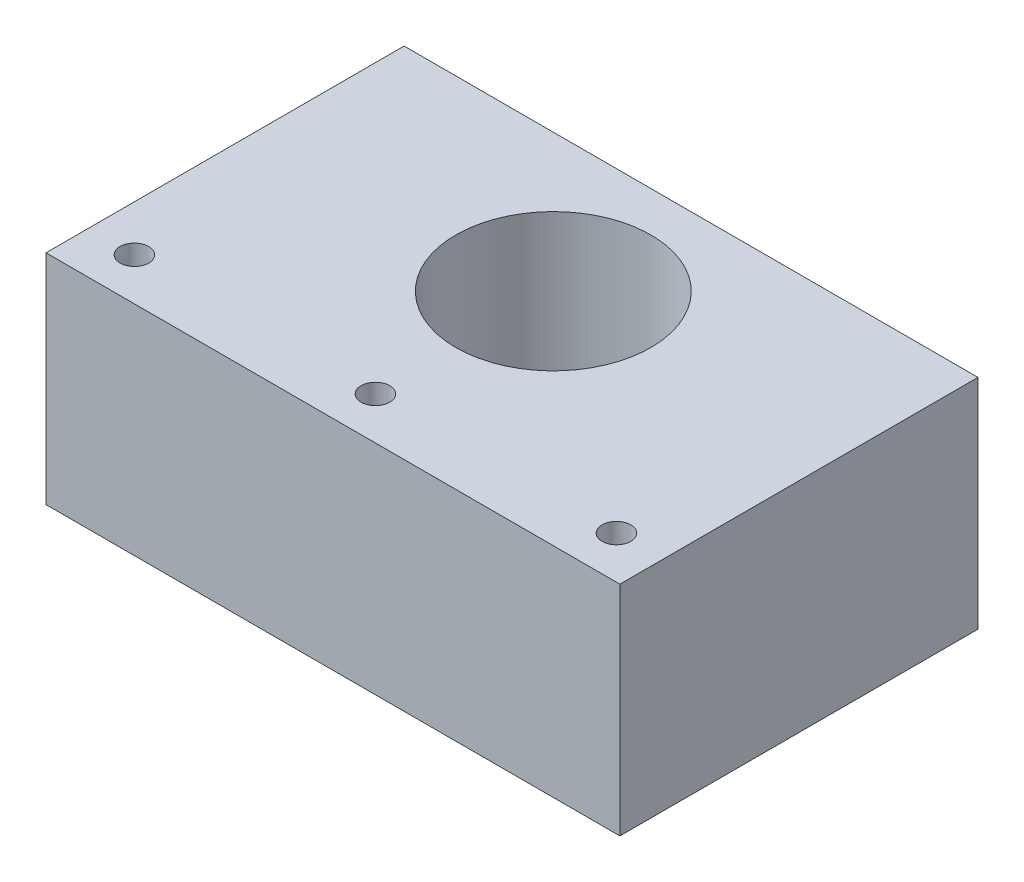
ISO-10303-21;
HEADER;
FILE_DESCRIPTION(('STEP AP214'),'2;1');
FILE_NAME('part.step','',(''),(''),'','','');
FILE_SCHEMA(('AUTOMOTIVE_DESIGN { 1 0 10303 214 1 1 1 1 }'));
ENDSEC;
DATA;
#1=APPLICATION_CONTEXT('core data for automotive mechanical design processes');
#2=APPLICATION_PROTOCOL_DEFINITION('international standard','automotive_design',2000,#1);
#3=PRODUCT_CONTEXT('',#1,'mechanical');
#4=PRODUCT('Part','Part','',(#3));
#5=PRODUCT_RELATED_PRODUCT_CATEGORY('part','',(#4));
#6=PRODUCT_DEFINITION_FORMATION('','',#4);
#7=PRODUCT_DEFINITION_CONTEXT('part definition',#1,'design');
#8=PRODUCT_DEFINITION('design','',#6,#7);
#9=PRODUCT_DEFINITION_SHAPE('','',#8);
#10=(LENGTH_UNIT() NAMED_UNIT(*) SI_UNIT(.MILLI.,.METRE.));
#11=(NAMED_UNIT(*) PLANE_ANGLE_UNIT() SI_UNIT($,.RADIAN.));
#12=(NAMED_UNIT(*) SI_UNIT($,.STERADIAN.) SOLID_ANGLE_UNIT());
#13=UNCERTAINTY_MEASURE_WITH_UNIT(LENGTH_MEASURE(1.E-05),#10,'distance_accuracy_value','');
#14=(GEOMETRIC_REPRESENTATION_CONTEXT(3) GLOBAL_UNCERTAINTY_ASSIGNED_CONTEXT((#13)) GLOBAL_UNIT_ASSIGNED_CONTEXT((#10,
#11,#12)) REPRESENTATION_CONTEXT('',''));
#15=CARTESIAN_POINT('',(0.,0.,0.));
#16=DIRECTION('',(0.,0.,1.));
#17=DIRECTION('',(1.,0.,0.));
#18=AXIS2_PLACEMENT_3D('',#15,#16,#17);
#19=CARTESIAN_POINT('',(0.,12.7,15.24));
#20=DIRECTION('',(0.,-1.,0.));
#21=DIRECTION('',(0.,0.,-1.));
#22=AXIS2_PLACEMENT_3D('',#19,#20,#21);
#23=CYLINDRICAL_SURFACE('',#22,6.35);
#24=CARTESIAN_POINT('',(0.,-7.874,15.24));
#25=DIRECTION('',(0.,-1.,0.));
#26=DIRECTION('',(0.,0.,-1.));
#27=AXIS2_PLACEMENT_3D('',#24,#25,#26);
#28=CIRCLE('',#27,6.35);
#29=CARTESIAN_POINT('',(0.,-7.874,8.89));
#30=VERTEX_POINT('',#29);
#31=EDGE_CURVE('E158',#30,#30,#28,.T.);
#32=ORIENTED_EDGE('',*,*,#31,.T.);
#33=EDGE_LOOP('',(#32));
#34=FACE_BOUND('',#33,.T.);
#35=CARTESIAN_POINT('',(0.,-6.35,15.24));
#36=DIRECTION('',(0.,1.,0.));
#37=DIRECTION('',(0.,0.,1.));
#38=AXIS2_PLACEMENT_3D('',#35,#36,#37);
#39=CIRCLE('',#38,6.35);
#40=CARTESIAN_POINT('',(0.,-6.35,21.59));
#41=VERTEX_POINT('',#40);
#42=EDGE_CURVE('E154',#41,#41,#39,.F.);
#43=ORIENTED_EDGE('',*,*,#42,.F.);
#44=EDGE_LOOP('',(#43));
#45=FACE_BOUND('',#44,.T.);
#46=ADVANCED_FACE('F39',(#34,#45),#23,.F.);
#47=CARTESIAN_POINT('',(-31.75,12.7,38.1));
#48=DIRECTION('',(1.,0.,0.));
#49=DIRECTION('',(0.,0.,-1.));
#50=AXIS2_PLACEMENT_3D('',#47,#48,#49);
#51=PLANE('',#50);
#52=DIRECTION('',(0.,-1.,0.));
#53=VECTOR('',#52,1.);
#54=CARTESIAN_POINT('',(-31.75,12.7,0.));
#55=LINE('',#54,#53);
#56=CARTESIAN_POINT('',(-31.75,12.7,0.));
#57=VERTEX_POINT('',#56);
#58=CARTESIAN_POINT('',(-31.75,-11.43,0.));
#59=VERTEX_POINT('',#58);
#60=EDGE_CURVE('E86',#57,#59,#55,.T.);
#61=ORIENTED_EDGE('',*,*,#60,.T.);
#62=DIRECTION('',(0.,0.,1.));
#63=VECTOR('',#62,1.);
#64=CARTESIAN_POINT('',(-31.75,-11.43,0.));
#65=LINE('',#64,#63);
#66=CARTESIAN_POINT('',(-31.75,-11.43,39.624));
#67=VERTEX_POINT('',#66);
#68=EDGE_CURVE('E57',#59,#67,#65,.T.);
#69=ORIENTED_EDGE('',*,*,#68,.T.);
#70=DIRECTION('',(0.,-1.,0.));
#71=VECTOR('',#70,1.);
#72=CARTESIAN_POINT('',(-31.75,12.7,39.624));
#73=LINE('',#72,#71);
#74=CARTESIAN_POINT('',(-31.75,12.7,39.624));
#75=VERTEX_POINT('',#74);
#76=EDGE_CURVE('E84',#75,#67,#73,.T.);
#77=ORIENTED_EDGE('',*,*,#76,.F.);
#78=DIRECTION('',(0.,0.,-1.));
#79=VECTOR('',#78,1.);
#80=CARTESIAN_POINT('',(-31.75,12.7,38.1));
#81=LINE('',#80,#79);
#82=EDGE_CURVE('E49',#75,#57,#81,.T.);
#83=ORIENTED_EDGE('',*,*,#82,.T.);
#84=EDGE_LOOP('',(#61,#69,#77,#83));
#85=FACE_BOUND('',#84,.T.);
#86=ADVANCED_FACE('F41',(#85),#51,.F.);
#87=CARTESIAN_POINT('',(31.75,12.7,38.1));
#88=DIRECTION('',(-1.,0.,0.));
#89=DIRECTION('',(0.,0.,1.));
#90=AXIS2_PLACEMENT_3D('',#87,#88,#89);
#91=PLANE('',#90);
#92=DIRECTION('',(0.,0.,-1.));
#93=VECTOR('',#92,1.);
#94=CARTESIAN_POINT('',(31.75,12.7,38.1));
#95=LINE('',#94,#93);
#96=CARTESIAN_POINT('',(31.75,12.7,39.624));
#97=VERTEX_POINT('',#96);
#98=CARTESIAN_POINT('',(31.75,12.7,0.));
#99=VERTEX_POINT('',#98);
#100=EDGE_CURVE('E11',#97,#99,#95,.T.);
#101=ORIENTED_EDGE('',*,*,#100,.F.);
#102=DIRECTION('',(0.,1.,0.));
#103=VECTOR('',#102,1.);
#104=CARTESIAN_POINT('',(31.75,-11.43,39.624));
#105=LINE('',#104,#103);
#106=CARTESIAN_POINT('',(31.75,-11.43,39.624));
#107=VERTEX_POINT('',#106);
#108=EDGE_CURVE('E99',#107,#97,#105,.T.);
#109=ORIENTED_EDGE('',*,*,#108,.F.);
#110=DIRECTION('',(0.,0.,1.));
#111=VECTOR('',#110,1.);
#112=CARTESIAN_POINT('',(31.75,-11.43,0.));
#113=LINE('',#112,#111);
#114=CARTESIAN_POINT('',(31.75,-11.43,0.));
#115=VERTEX_POINT('',#114);
#116=EDGE_CURVE('E88',#115,#107,#113,.T.);
#117=ORIENTED_EDGE('',*,*,#116,.F.);
#118=DIRECTION('',(0.,1.,0.));
#119=VECTOR('',#118,1.);
#120=CARTESIAN_POINT('',(31.75,12.7,0.));
#121=LINE('',#120,#119);
#122=EDGE_CURVE('E176',#115,#99,#121,.T.);
#123=ORIENTED_EDGE('',*,*,#122,.T.);
#124=EDGE_LOOP('',(#101,#109,#117,#123));
#125=FACE_BOUND('',#124,.T.);
#126=ADVANCED_FACE('F194',(#125),#91,.F.);
#127=CARTESIAN_POINT('',(-31.75,12.7,38.1));
#128=DIRECTION('',(0.,-1.,0.));
#129=DIRECTION('',(0.,0.,-1.));
#130=AXIS2_PLACEMENT_3D('',#127,#128,#129);
#131=PLANE('',#130);
#132=CARTESIAN_POINT('',(-26.67,12.7,34.925));
#133=DIRECTION('',(0.,1.,0.));
#134=DIRECTION('',(0.,0.,1.));
#135=AXIS2_PLACEMENT_3D('',#132,#133,#134);
#136=CIRCLE('',#135,1.5875);
#137=CARTESIAN_POINT('',(-26.67,12.7,36.5125));
#138=VERTEX_POINT('',#137);
#139=EDGE_CURVE('E138',#138,#138,#136,.T.);
#140=ORIENTED_EDGE('',*,*,#139,.F.);
#141=EDGE_LOOP('',(#140));
#142=FACE_BOUND('',#141,.T.);
#143=CARTESIAN_POINT('',(0.,12.7,34.925));
#144=DIRECTION('',(0.,1.,0.));
#145=DIRECTION('',(0.,0.,1.));
#146=AXIS2_PLACEMENT_3D('',#143,#144,#145);
#147=CIRCLE('',#146,1.5875);
#148=CARTESIAN_POINT('',(0.,12.7,36.5125));
#149=VERTEX_POINT('',#148);
#150=EDGE_CURVE('E143',#149,#149,#147,.T.);
#151=ORIENTED_EDGE('',*,*,#150,.F.);
#152=EDGE_LOOP('',(#151));
#153=FACE_BOUND('',#152,.T.);
#154=CARTESIAN_POINT('',(26.67,12.7,34.925));
#155=DIRECTION('',(0.,1.,0.));
#156=DIRECTION('',(0.,0.,1.));
#157=AXIS2_PLACEMENT_3D('',#154,#155,#156);
#158=CIRCLE('',#157,1.5875);
#159=CARTESIAN_POINT('',(26.67,12.7,36.5125));
#160=VERTEX_POINT('',#159);
#161=EDGE_CURVE('E137',#160,#160,#158,.T.);
#162=ORIENTED_EDGE('',*,*,#161,.F.);
#163=EDGE_LOOP('',(#162));
#164=FACE_BOUND('',#163,.T.);
#165=CARTESIAN_POINT('',(0.,12.7,15.24));
#166=DIRECTION('',(0.,1.,0.));
#167=DIRECTION('',(0.,0.,1.));
#168=AXIS2_PLACEMENT_3D('',#165,#166,#167);
#169=CIRCLE('',#168,10.795);
#170=CARTESIAN_POINT('',(0.,12.7,26.035));
#171=VERTEX_POINT('',#170);
#172=EDGE_CURVE('E142',#171,#171,#169,.T.);
#173=ORIENTED_EDGE('',*,*,#172,.F.);
#174=EDGE_LOOP('',(#173));
#175=FACE_BOUND('',#174,.T.);
#176=DIRECTION('',(-1.,0.,0.));
#177=VECTOR('',#176,1.);
#178=CARTESIAN_POINT('',(-31.75,12.7,0.));
#179=LINE('',#178,#177);
#180=EDGE_CURVE('E64',#99,#57,#179,.T.);
#181=ORIENTED_EDGE('',*,*,#180,.T.);
#182=ORIENTED_EDGE('',*,*,#82,.F.);
#183=DIRECTION('',(-1.,0.,0.));
#184=VECTOR('',#183,1.);
#185=CARTESIAN_POINT('',(31.75,12.7,39.624));
#186=LINE('',#185,#184);
#187=EDGE_CURVE('E104',#97,#75,#186,.T.);
#188=ORIENTED_EDGE('',*,*,#187,.F.);
#189=ORIENTED_EDGE('',*,*,#100,.T.);
#190=EDGE_LOOP('',(#181,#182,#188,#189));
#191=FACE_BOUND('',#190,.T.);
#192=ADVANCED_FACE('F226',(#142,#153,#164,#175,#191),#131,.F.);
#193=CARTESIAN_POINT('',(0.,0.,0.));
#194=DIRECTION('',(0.,0.,1.));
#195=DIRECTION('',(1.,0.,0.));
#196=AXIS2_PLACEMENT_3D('',#193,#194,#195);
#197=PLANE('',#196);
#198=ORIENTED_EDGE('',*,*,#122,.F.);
#199=DIRECTION('',(-1.,0.,0.));
#200=VECTOR('',#199,1.);
#201=CARTESIAN_POINT('',(-31.75,-11.43,0.));
#202=LINE('',#201,#200);
#203=EDGE_CURVE('E112',#115,#59,#202,.T.);
#204=ORIENTED_EDGE('',*,*,#203,.T.);
#205=ORIENTED_EDGE('',*,*,#60,.F.);
#206=ORIENTED_EDGE('',*,*,#180,.F.);
#207=EDGE_LOOP('',(#198,#204,#205,#206));
#208=FACE_BOUND('',#207,.T.);
#209=ADVANCED_FACE('F206',(#208),#197,.F.);
#210=CARTESIAN_POINT('',(0.,-7.874,15.24));
#211=DIRECTION('',(0.,-1.,0.));
#212=DIRECTION('',(0.,0.,-1.));
#213=AXIS2_PLACEMENT_3D('',#210,#211,#212);
#214=CYLINDRICAL_SURFACE('',#213,8.763);
#215=CARTESIAN_POINT('',(0.,-11.43,15.24));
#216=DIRECTION('',(0.,1.,0.));
#217=DIRECTION('',(0.,0.,1.));
#218=AXIS2_PLACEMENT_3D('',#215,#216,#217);
#219=CIRCLE('',#218,8.763);
#220=CARTESIAN_POINT('',(0.,-11.43,24.003));
#221=VERTEX_POINT('',#220);
#222=EDGE_CURVE('E125',#221,#221,#219,.F.);
#223=ORIENTED_EDGE('',*,*,#222,.T.);
#224=EDGE_LOOP('',(#223));
#225=FACE_BOUND('',#224,.T.);
#226=CARTESIAN_POINT('',(0.,-7.874,15.24));
#227=DIRECTION('',(0.,-1.,0.));
#228=DIRECTION('',(0.,0.,-1.));
#229=AXIS2_PLACEMENT_3D('',#226,#227,#228);
#230=CIRCLE('',#229,8.763);
#231=CARTESIAN_POINT('',(0.,-7.874,6.47700000000001));
#232=VERTEX_POINT('',#231);
#233=EDGE_CURVE('E162',#232,#232,#230,.T.);
#234=ORIENTED_EDGE('',*,*,#233,.F.);
#235=EDGE_LOOP('',(#234));
#236=FACE_BOUND('',#235,.T.);
#237=ADVANCED_FACE('F202',(#225,#236),#214,.F.);
#238=CARTESIAN_POINT('',(0.,-7.874,15.24));
#239=DIRECTION('',(0.,-1.,0.));
#240=DIRECTION('',(0.,0.,-1.));
#241=AXIS2_PLACEMENT_3D('',#238,#239,#240);
#242=PLANE('',#241);
#243=ORIENTED_EDGE('',*,*,#31,.F.);
#244=EDGE_LOOP('',(#243));
#245=FACE_BOUND('',#244,.T.);
#246=ORIENTED_EDGE('',*,*,#233,.T.);
#247=EDGE_LOOP('',(#246));
#248=FACE_BOUND('',#247,.T.);
#249=ADVANCED_FACE('F199',(#245,#248),#242,.T.);
#250=CARTESIAN_POINT('',(0.,-6.35,15.24));
#251=DIRECTION('',(0.,1.,0.));
#252=DIRECTION('',(0.,0.,1.));
#253=AXIS2_PLACEMENT_3D('',#250,#251,#252);
#254=PLANE('',#253);
#255=CARTESIAN_POINT('',(0.,-6.35,15.24));
#256=DIRECTION('',(0.,1.,0.));
#257=DIRECTION('',(0.,0.,1.));
#258=AXIS2_PLACEMENT_3D('',#255,#256,#257);
#259=CIRCLE('',#258,10.795);
#260=CARTESIAN_POINT('',(0.,-6.35,26.035));
#261=VERTEX_POINT('',#260);
#262=EDGE_CURVE('E150',#261,#261,#259,.T.);
#263=ORIENTED_EDGE('',*,*,#262,.T.);
#264=EDGE_LOOP('',(#263));
#265=FACE_BOUND('',#264,.T.);
#266=ORIENTED_EDGE('',*,*,#42,.T.);
#267=EDGE_LOOP('',(#266));
#268=FACE_BOUND('',#267,.T.);
#269=ADVANCED_FACE('F186',(#265,#268),#254,.T.);
#270=CARTESIAN_POINT('',(0.,-6.35,15.24));
#271=DIRECTION('',(0.,1.,0.));
#272=DIRECTION('',(0.,0.,1.));
#273=AXIS2_PLACEMENT_3D('',#270,#271,#272);
#274=CYLINDRICAL_SURFACE('',#273,10.795);
#275=CARTESIAN_POINT('',(0.,-6.35,26.035));
#276=CARTESIAN_POINT('',(0.,-6.1515625,26.035));
#277=CARTESIAN_POINT('',(0.,-5.953125,26.035));
#278=CARTESIAN_POINT('',(0.,-5.55625,26.035));
#279=CARTESIAN_POINT('',(0.,-5.3578125,26.035));
#280=CARTESIAN_POINT('',(0.,-4.9609375,26.035));
#281=CARTESIAN_POINT('',(0.,-4.7625,26.035));
#282=CARTESIAN_POINT('',(0.,-4.365625,26.035));
#283=CARTESIAN_POINT('',(0.,-4.1671875,26.035));
#284=CARTESIAN_POINT('',(0.,-3.7703125,26.035));
#285=CARTESIAN_POINT('',(0.,-3.571875,26.035));
#286=CARTESIAN_POINT('',(0.,-3.175,26.035));
#287=CARTESIAN_POINT('',(0.,-2.9765625,26.035));
#288=CARTESIAN_POINT('',(0.,-2.5796875,26.035));
#289=CARTESIAN_POINT('',(0.,-2.38125,26.035));
#290=CARTESIAN_POINT('',(0.,-1.984375,26.035));
#291=CARTESIAN_POINT('',(0.,-1.7859375,26.035));
#292=CARTESIAN_POINT('',(0.,-1.3890625,26.035));
#293=CARTESIAN_POINT('',(0.,-1.190625,26.035));
#294=CARTESIAN_POINT('',(0.,-0.793750000000001,26.035));
#295=CARTESIAN_POINT('',(0.,-0.595312500000001,26.035));
#296=CARTESIAN_POINT('',(0.,-0.198437500000001,26.035));
#297=CARTESIAN_POINT('',(0.,0.,26.035));
#298=CARTESIAN_POINT('',(0.,0.396874999999999,26.035));
#299=CARTESIAN_POINT('',(0.,0.595312499999999,26.035));
#300=CARTESIAN_POINT('',(0.,0.992187499999999,26.035));
#301=CARTESIAN_POINT('',(0.,1.190625,26.035));
#302=CARTESIAN_POINT('',(0.,1.5875,26.035));
#303=CARTESIAN_POINT('',(0.,1.7859375,26.035));
#304=CARTESIAN_POINT('',(0.,2.1828125,26.035));
#305=CARTESIAN_POINT('',(0.,2.38125,26.035));
#306=CARTESIAN_POINT('',(0.,2.778125,26.035));
#307=CARTESIAN_POINT('',(0.,2.9765625,26.035));
#308=CARTESIAN_POINT('',(0.,3.3734375,26.035));
#309=CARTESIAN_POINT('',(0.,3.571875,26.035));
#310=CARTESIAN_POINT('',(0.,3.96875,26.035));
#311=CARTESIAN_POINT('',(0.,4.1671875,26.035));
#312=CARTESIAN_POINT('',(0.,4.5640625,26.035));
#313=CARTESIAN_POINT('',(0.,4.7625,26.035));
#314=CARTESIAN_POINT('',(0.,5.159375,26.035));
#315=CARTESIAN_POINT('',(0.,5.3578125,26.035));
#316=CARTESIAN_POINT('',(0.,5.7546875,26.035));
#317=CARTESIAN_POINT('',(0.,5.953125,26.035));
#318=CARTESIAN_POINT('',(0.,6.35,26.035));
#319=CARTESIAN_POINT('',(0.,6.5484375,26.035));
#320=CARTESIAN_POINT('',(0.,6.9453125,26.035));
#321=CARTESIAN_POINT('',(0.,7.14375,26.035));
#322=CARTESIAN_POINT('',(0.,7.540625,26.035));
#323=CARTESIAN_POINT('',(0.,7.7390625,26.035));
#324=CARTESIAN_POINT('',(0.,8.1359375,26.035));
#325=CARTESIAN_POINT('',(0.,8.334375,26.035));
#326=CARTESIAN_POINT('',(0.,8.73125,26.035));
#327=CARTESIAN_POINT('',(0.,8.9296875,26.035));
#328=CARTESIAN_POINT('',(0.,9.3265625,26.035));
#329=CARTESIAN_POINT('',(0.,9.525,26.035));
#330=CARTESIAN_POINT('',(0.,9.921875,26.035));
#331=CARTESIAN_POINT('',(0.,10.1203125,26.035));
#332=CARTESIAN_POINT('',(0.,10.5171875,26.035));
#333=CARTESIAN_POINT('',(0.,10.715625,26.035));
#334=CARTESIAN_POINT('',(0.,11.1125,26.035));
#335=CARTESIAN_POINT('',(0.,11.3109375,26.035));
#336=CARTESIAN_POINT('',(0.,11.7078125,26.035));
#337=CARTESIAN_POINT('',(0.,11.90625,26.035));
#338=CARTESIAN_POINT('',(0.,12.303125,26.035));
#339=CARTESIAN_POINT('',(0.,12.5015625,26.035));
#340=CARTESIAN_POINT('',(0.,12.7,26.035));
#341=B_SPLINE_CURVE_WITH_KNOTS('',3,(#275,#276,#277,#278,#279,#280,#281,#282,#283,#284,#285,
#286,#287,#288,#289,#290,#291,#292,#293,#294,#295,#296,#297,#298,#299,#300,#301,#302,#303,#304,
#305,#306,#307,#308,#309,#310,#311,#312,#313,#314,#315,#316,#317,#318,#319,#320,#321,#322,#323,
#324,#325,#326,#327,#328,#329,#330,#331,#332,#333,#334,#335,#336,#337,#338,#339,#340),
.UNSPECIFIED.,.F.,.F.,(4,2,2,2,2,2,2,2,2,2,2,2,2,2,2,2,2,2,2,2,2,2,2,2,2,2,2,2,2,2,2,2,4),(0.,
0.595312499999999,1.190625,1.7859375,2.38125,2.9765625,3.571875,4.1671875,4.7625,5.3578125,
5.953125,6.5484375,7.14375,7.7390625,8.334375,8.9296875,9.525,10.1203125,10.715625,11.3109375,
11.90625,12.5015625,13.096875,13.6921875,14.2875,14.8828125,15.478125,16.0734375,16.66875,
17.2640625,17.859375,18.4546875,19.05),.UNSPECIFIED.);
#342=EDGE_CURVE('BSEAM197',#261,#171,#341,.T.);
#343=ORIENTED_EDGE('',*,*,#262,.F.);
#344=ORIENTED_EDGE('',*,*,#172,.T.);
#345=ORIENTED_EDGE('',*,*,#342,.T.);
#346=ORIENTED_EDGE('',*,*,#342,.F.);
#347=EDGE_LOOP('',(#343,#345,#344,#346));
#348=FACE_BOUND('',#347,.T.);
#349=ADVANCED_FACE('F197',(#348),#274,.F.);
#350=CARTESIAN_POINT('',(26.67,-38.1,34.925));
#351=DIRECTION('',(0.,1.,0.));
#352=DIRECTION('',(0.,0.,1.));
#353=AXIS2_PLACEMENT_3D('',#350,#351,#352);
#354=CYLINDRICAL_SURFACE('',#353,1.5875);
#355=CARTESIAN_POINT('',(26.67,-11.43,34.925));
#356=DIRECTION('',(0.,1.,0.));
#357=DIRECTION('',(0.,0.,1.));
#358=AXIS2_PLACEMENT_3D('',#355,#356,#357);
#359=CIRCLE('',#358,1.5875);
#360=CARTESIAN_POINT('',(26.67,-11.43,36.5125));
#361=VERTEX_POINT('',#360);
#362=EDGE_CURVE('E121',#361,#361,#359,.F.);
#363=ORIENTED_EDGE('',*,*,#362,.T.);
#364=EDGE_LOOP('',(#363));
#365=FACE_BOUND('',#364,.T.);
#366=ORIENTED_EDGE('',*,*,#161,.T.);
#367=EDGE_LOOP('',(#366));
#368=FACE_BOUND('',#367,.T.);
#369=ADVANCED_FACE('F268',(#365,#368),#354,.F.);
#370=CARTESIAN_POINT('',(0.,-38.1,34.925));
#371=DIRECTION('',(0.,1.,0.));
#372=DIRECTION('',(0.,0.,1.));
#373=AXIS2_PLACEMENT_3D('',#370,#371,#372);
#374=CYLINDRICAL_SURFACE('',#373,1.5875);
#375=CARTESIAN_POINT('',(0.,-11.43,34.925));
#376=DIRECTION('',(0.,1.,0.));
#377=DIRECTION('',(0.,0.,1.));
#378=AXIS2_PLACEMENT_3D('',#375,#376,#377);
#379=CIRCLE('',#378,1.5875);
#380=CARTESIAN_POINT('',(0.,-11.43,36.5125));
#381=VERTEX_POINT('',#380);
#382=EDGE_CURVE('E117',#381,#381,#379,.F.);
#383=ORIENTED_EDGE('',*,*,#382,.T.);
#384=EDGE_LOOP('',(#383));
#385=FACE_BOUND('',#384,.T.);
#386=ORIENTED_EDGE('',*,*,#150,.T.);
#387=EDGE_LOOP('',(#386));
#388=FACE_BOUND('',#387,.T.);
#389=ADVANCED_FACE('F274',(#385,#388),#374,.F.);
#390=CARTESIAN_POINT('',(-26.67,-38.1,34.925));
#391=DIRECTION('',(0.,1.,0.));
#392=DIRECTION('',(0.,0.,1.));
#393=AXIS2_PLACEMENT_3D('',#390,#391,#392);
#394=CYLINDRICAL_SURFACE('',#393,1.5875);
#395=CARTESIAN_POINT('',(-26.67,-11.43,34.925));
#396=DIRECTION('',(0.,1.,0.));
#397=DIRECTION('',(0.,0.,1.));
#398=AXIS2_PLACEMENT_3D('',#395,#396,#397);
#399=CIRCLE('',#398,1.5875);
#400=CARTESIAN_POINT('',(-26.67,-11.43,36.5125));
#401=VERTEX_POINT('',#400);
#402=EDGE_CURVE('E43',#401,#401,#399,.F.);
#403=ORIENTED_EDGE('',*,*,#402,.T.);
#404=EDGE_LOOP('',(#403));
#405=FACE_BOUND('',#404,.T.);
#406=ORIENTED_EDGE('',*,*,#139,.T.);
#407=EDGE_LOOP('',(#406));
#408=FACE_BOUND('',#407,.T.);
#409=ADVANCED_FACE('F282',(#405,#408),#394,.F.);
#410=CARTESIAN_POINT('',(-31.75,-11.43,0.));
#411=DIRECTION('',(0.,1.,0.));
#412=DIRECTION('',(0.,0.,1.));
#413=AXIS2_PLACEMENT_3D('',#410,#411,#412);
#414=PLANE('',#413);
#415=CARTESIAN_POINT('',(-24.765,-11.43,15.24));
#416=DIRECTION('',(0.,1.,0.));
#417=DIRECTION('',(0.,0.,1.));
#418=AXIS2_PLACEMENT_3D('',#415,#416,#417);
#419=CIRCLE('',#418,3.175);
#420=CARTESIAN_POINT('',(-24.765,-11.43,18.415));
#421=VERTEX_POINT('',#420);
#422=EDGE_CURVE('E129',#421,#421,#419,.F.);
#423=ORIENTED_EDGE('',*,*,#422,.F.);
#424=EDGE_LOOP('',(#423));
#425=FACE_BOUND('',#424,.T.);
#426=ORIENTED_EDGE('',*,*,#362,.F.);
#427=EDGE_LOOP('',(#426));
#428=FACE_BOUND('',#427,.T.);
#429=ORIENTED_EDGE('',*,*,#402,.F.);
#430=EDGE_LOOP('',(#429));
#431=FACE_BOUND('',#430,.T.);
#432=ORIENTED_EDGE('',*,*,#116,.T.);
#433=DIRECTION('',(1.,0.,0.));
#434=VECTOR('',#433,1.);
#435=CARTESIAN_POINT('',(-31.75,-11.43,39.624));
#436=LINE('',#435,#434);
#437=EDGE_CURVE('E91',#67,#107,#436,.T.);
#438=ORIENTED_EDGE('',*,*,#437,.F.);
#439=ORIENTED_EDGE('',*,*,#68,.F.);
#440=ORIENTED_EDGE('',*,*,#203,.F.);
#441=EDGE_LOOP('',(#432,#438,#439,#440));
#442=FACE_BOUND('',#441,.T.);
#443=ORIENTED_EDGE('',*,*,#382,.F.);
#444=EDGE_LOOP('',(#443));
#445=FACE_BOUND('',#444,.T.);
#446=ORIENTED_EDGE('',*,*,#222,.F.);
#447=EDGE_LOOP('',(#446));
#448=FACE_BOUND('',#447,.T.);
#449=CARTESIAN_POINT('',(24.765,-11.43,15.24));
#450=DIRECTION('',(0.,1.,0.));
#451=DIRECTION('',(0.,0.,1.));
#452=AXIS2_PLACEMENT_3D('',#449,#450,#451);
#453=CIRCLE('',#452,3.175);
#454=CARTESIAN_POINT('',(24.765,-11.43,18.415));
#455=VERTEX_POINT('',#454);
#456=EDGE_CURVE('E133',#455,#455,#453,.F.);
#457=ORIENTED_EDGE('',*,*,#456,.F.);
#458=EDGE_LOOP('',(#457));
#459=FACE_BOUND('',#458,.T.);
#460=ADVANCED_FACE('F92',(#425,#428,#431,#442,#445,#448,#459),#414,.F.);
#461=CARTESIAN_POINT('',(0.,0.,0.));
#462=DIRECTION('',(0.,-1.,0.));
#463=DIRECTION('',(0.,0.,-1.));
#464=AXIS2_PLACEMENT_3D('',#461,#462,#463);
#465=PLANE('',#464);
#466=CARTESIAN_POINT('',(-24.765,0.,15.24));
#467=DIRECTION('',(0.,-1.,0.));
#468=DIRECTION('',(0.,0.,-1.));
#469=AXIS2_PLACEMENT_3D('',#466,#467,#468);
#470=CIRCLE('',#469,3.175);
#471=CARTESIAN_POINT('',(-24.765,0.,12.065));
#472=VERTEX_POINT('',#471);
#473=EDGE_CURVE('E167',#472,#472,#470,.T.);
#474=ORIENTED_EDGE('',*,*,#473,.T.);
#475=EDGE_LOOP('',(#474));
#476=FACE_BOUND('',#475,.T.);
#477=ADVANCED_FACE('F208',(#476),#465,.T.);
#478=CARTESIAN_POINT('',(-24.765,0.,15.24));
#479=DIRECTION('',(0.,-1.,0.));
#480=DIRECTION('',(0.,0.,-1.));
#481=AXIS2_PLACEMENT_3D('',#478,#479,#480);
#482=CYLINDRICAL_SURFACE('',#481,3.175);
#483=ORIENTED_EDGE('',*,*,#422,.T.);
#484=EDGE_LOOP('',(#483));
#485=FACE_BOUND('',#484,.T.);
#486=ORIENTED_EDGE('',*,*,#473,.F.);
#487=EDGE_LOOP('',(#486));
#488=FACE_BOUND('',#487,.T.);
#489=ADVANCED_FACE('F211',(#485,#488),#482,.F.);
#490=CARTESIAN_POINT('',(24.765,0.,15.24));
#491=DIRECTION('',(0.,-1.,0.));
#492=DIRECTION('',(0.,0.,-1.));
#493=AXIS2_PLACEMENT_3D('',#490,#491,#492);
#494=PLANE('',#493);
#495=CARTESIAN_POINT('',(24.765,0.,15.24));
#496=DIRECTION('',(0.,-1.,0.));
#497=DIRECTION('',(0.,0.,-1.));
#498=AXIS2_PLACEMENT_3D('',#495,#496,#497);
#499=CIRCLE('',#498,3.175);
#500=CARTESIAN_POINT('',(24.765,0.,12.065));
#501=VERTEX_POINT('',#500);
#502=EDGE_CURVE('E166',#501,#501,#499,.T.);
#503=ORIENTED_EDGE('',*,*,#502,.T.);
#504=EDGE_LOOP('',(#503));
#505=FACE_BOUND('',#504,.T.);
#506=ADVANCED_FACE('F215',(#505),#494,.T.);
#507=CARTESIAN_POINT('',(24.765,0.,15.24));
#508=DIRECTION('',(0.,-1.,0.));
#509=DIRECTION('',(0.,0.,-1.));
#510=AXIS2_PLACEMENT_3D('',#507,#508,#509);
#511=CYLINDRICAL_SURFACE('',#510,3.175);
#512=ORIENTED_EDGE('',*,*,#456,.T.);
#513=EDGE_LOOP('',(#512));
#514=FACE_BOUND('',#513,.T.);
#515=ORIENTED_EDGE('',*,*,#502,.F.);
#516=EDGE_LOOP('',(#515));
#517=FACE_BOUND('',#516,.T.);
#518=ADVANCED_FACE('F217',(#514,#517),#511,.F.);
#519=CARTESIAN_POINT('',(0.,0.,39.624));
#520=DIRECTION('',(0.,0.,1.));
#521=DIRECTION('',(1.,0.,0.));
#522=AXIS2_PLACEMENT_3D('',#519,#520,#521);
#523=PLANE('',#522);
#524=ORIENTED_EDGE('',*,*,#76,.T.);
#525=ORIENTED_EDGE('',*,*,#437,.T.);
#526=ORIENTED_EDGE('',*,*,#108,.T.);
#527=ORIENTED_EDGE('',*,*,#187,.T.);
#528=EDGE_LOOP('',(#524,#525,#526,#527));
#529=FACE_BOUND('',#528,.T.);
#530=ADVANCED_FACE('F102',(#529),#523,.T.);
#531=CLOSED_SHELL('',(#46,#86,#126,#192,#209,#237,#249,#269,#349,#369,#389,#409,#460,#477,#489,
#506,#518,#530));
#532=MANIFOLD_SOLID_BREP('B2',#531);
#533=ADVANCED_BREP_SHAPE_REPRESENTATION('',(#18,#532),#14);
#534=SHAPE_DEFINITION_REPRESENTATION(#9,#533);
ENDSEC;
END-ISO-10303-21;
